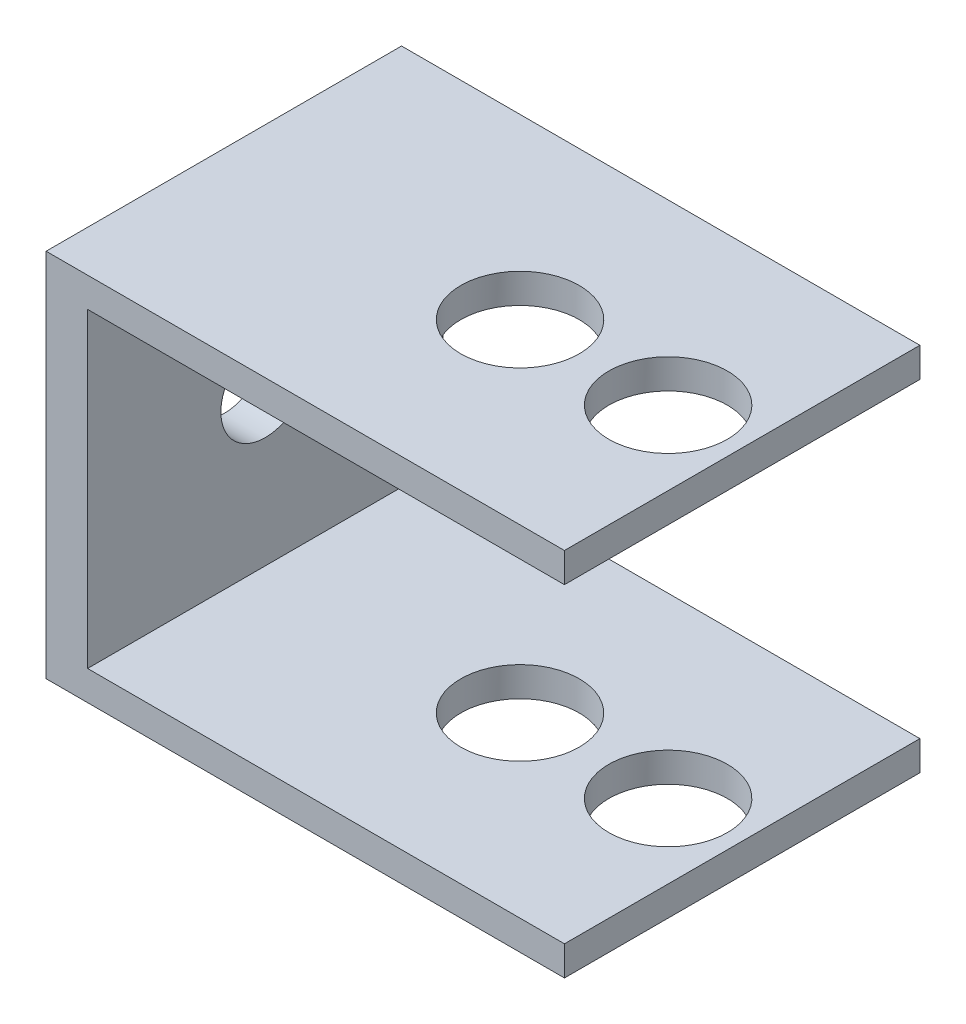
ISO-10303-21;
HEADER;
FILE_DESCRIPTION(('STEP AP214'),'2;1');
FILE_NAME('part.step','',(''),(''),'','','');
FILE_SCHEMA(('AUTOMOTIVE_DESIGN { 1 0 10303 214 1 1 1 1 }'));
ENDSEC;
DATA;
#1=APPLICATION_CONTEXT('core data for automotive mechanical design processes');
#2=APPLICATION_PROTOCOL_DEFINITION('international standard','automotive_design',2000,#1);
#3=PRODUCT_CONTEXT('',#1,'mechanical');
#4=PRODUCT('Part','Part','',(#3));
#5=PRODUCT_RELATED_PRODUCT_CATEGORY('part','',(#4));
#6=PRODUCT_DEFINITION_FORMATION('','',#4);
#7=PRODUCT_DEFINITION_CONTEXT('part definition',#1,'design');
#8=PRODUCT_DEFINITION('design','',#6,#7);
#9=PRODUCT_DEFINITION_SHAPE('','',#8);
#10=(LENGTH_UNIT() NAMED_UNIT(*) SI_UNIT(.MILLI.,.METRE.));
#11=(NAMED_UNIT(*) PLANE_ANGLE_UNIT() SI_UNIT($,.RADIAN.));
#12=(NAMED_UNIT(*) SI_UNIT($,.STERADIAN.) SOLID_ANGLE_UNIT());
#13=UNCERTAINTY_MEASURE_WITH_UNIT(LENGTH_MEASURE(1.E-05),#10,'distance_accuracy_value','');
#14=(GEOMETRIC_REPRESENTATION_CONTEXT(3) GLOBAL_UNCERTAINTY_ASSIGNED_CONTEXT((#13)) GLOBAL_UNIT_ASSIGNED_CONTEXT((#10,
#11,#12)) REPRESENTATION_CONTEXT('',''));
#15=CARTESIAN_POINT('',(0.,0.,0.));
#16=DIRECTION('',(0.,0.,1.));
#17=DIRECTION('',(1.,0.,0.));
#18=AXIS2_PLACEMENT_3D('',#15,#16,#17);
#19=CARTESIAN_POINT('',(-17.5,-12.5,24.));
#20=DIRECTION('',(0.,1.,0.));
#21=DIRECTION('',(0.,0.,1.));
#22=AXIS2_PLACEMENT_3D('',#19,#20,#21);
#23=PLANE('',#22);
#24=CARTESIAN_POINT('',(12.5,-12.5,12.));
#25=DIRECTION('',(0.,1.,0.));
#26=DIRECTION('',(0.,0.,1.));
#27=AXIS2_PLACEMENT_3D('',#24,#25,#26);
#28=CIRCLE('',#27,4.);
#29=CARTESIAN_POINT('',(12.5,-12.5,16.));
#30=VERTEX_POINT('',#29);
#31=EDGE_CURVE('E190',#30,#30,#28,.F.);
#32=ORIENTED_EDGE('',*,*,#31,.F.);
#33=EDGE_LOOP('',(#32));
#34=FACE_BOUND('',#33,.T.);
#35=CARTESIAN_POINT('',(2.5,-12.5,12.));
#36=DIRECTION('',(0.,1.,0.));
#37=DIRECTION('',(0.,0.,1.));
#38=AXIS2_PLACEMENT_3D('',#35,#36,#37);
#39=CIRCLE('',#38,4.);
#40=CARTESIAN_POINT('',(2.5,-12.5,16.));
#41=VERTEX_POINT('',#40);
#42=EDGE_CURVE('E191',#41,#41,#39,.F.);
#43=ORIENTED_EDGE('',*,*,#42,.F.);
#44=EDGE_LOOP('',(#43));
#45=FACE_BOUND('',#44,.T.);
#46=DIRECTION('',(1.,0.,0.));
#47=VECTOR('',#46,1.);
#48=CARTESIAN_POINT('',(-17.5,-12.5,0.));
#49=LINE('',#48,#47);
#50=CARTESIAN_POINT('',(-17.5,-12.5,0.));
#51=VERTEX_POINT('',#50);
#52=CARTESIAN_POINT('',(17.5,-12.5,0.));
#53=VERTEX_POINT('',#52);
#54=EDGE_CURVE('E131',#51,#53,#49,.T.);
#55=ORIENTED_EDGE('',*,*,#54,.T.);
#56=DIRECTION('',(0.,0.,-1.));
#57=VECTOR('',#56,1.);
#58=CARTESIAN_POINT('',(17.5,-12.5,24.));
#59=LINE('',#58,#57);
#60=CARTESIAN_POINT('',(17.5,-12.5,24.));
#61=VERTEX_POINT('',#60);
#62=EDGE_CURVE('E11',#61,#53,#59,.T.);
#63=ORIENTED_EDGE('',*,*,#62,.F.);
#64=DIRECTION('',(1.,0.,0.));
#65=VECTOR('',#64,1.);
#66=CARTESIAN_POINT('',(-17.5,-12.5,24.));
#67=LINE('',#66,#65);
#68=CARTESIAN_POINT('',(-17.5,-12.5,24.));
#69=VERTEX_POINT('',#68);
#70=EDGE_CURVE('E146',#69,#61,#67,.T.);
#71=ORIENTED_EDGE('',*,*,#70,.F.);
#72=DIRECTION('',(0.,0.,-1.));
#73=VECTOR('',#72,1.);
#74=CARTESIAN_POINT('',(-17.5,-12.5,24.));
#75=LINE('',#74,#73);
#76=EDGE_CURVE('E127',#69,#51,#75,.T.);
#77=ORIENTED_EDGE('',*,*,#76,.T.);
#78=EDGE_LOOP('',(#55,#63,#71,#77));
#79=FACE_BOUND('',#78,.T.);
#80=ADVANCED_FACE('F35',(#34,#45,#79),#23,.F.);
#81=CARTESIAN_POINT('',(17.5,-10.5,24.));
#82=DIRECTION('',(-1.,0.,0.));
#83=DIRECTION('',(0.,0.,1.));
#84=AXIS2_PLACEMENT_3D('',#81,#82,#83);
#85=PLANE('',#84);
#86=DIRECTION('',(0.,1.,0.));
#87=VECTOR('',#86,1.);
#88=CARTESIAN_POINT('',(17.5,-10.5,0.));
#89=LINE('',#88,#87);
#90=CARTESIAN_POINT('',(17.5,-10.5,0.));
#91=VERTEX_POINT('',#90);
#92=EDGE_CURVE('E134',#53,#91,#89,.T.);
#93=ORIENTED_EDGE('',*,*,#92,.T.);
#94=DIRECTION('',(0.,0.,-1.));
#95=VECTOR('',#94,1.);
#96=CARTESIAN_POINT('',(17.5,-10.5,24.));
#97=LINE('',#96,#95);
#98=CARTESIAN_POINT('',(17.5,-10.5,24.));
#99=VERTEX_POINT('',#98);
#100=EDGE_CURVE('E43',#99,#91,#97,.T.);
#101=ORIENTED_EDGE('',*,*,#100,.F.);
#102=DIRECTION('',(0.,1.,0.));
#103=VECTOR('',#102,1.);
#104=CARTESIAN_POINT('',(17.5,-10.5,24.));
#105=LINE('',#104,#103);
#106=EDGE_CURVE('E94',#61,#99,#105,.T.);
#107=ORIENTED_EDGE('',*,*,#106,.F.);
#108=ORIENTED_EDGE('',*,*,#62,.T.);
#109=EDGE_LOOP('',(#93,#101,#107,#108));
#110=FACE_BOUND('',#109,.T.);
#111=ADVANCED_FACE('F224',(#110),#85,.F.);
#112=CARTESIAN_POINT('',(17.5,-10.5,24.));
#113=DIRECTION('',(0.,-1.,0.));
#114=DIRECTION('',(1.,0.,0.));
#115=AXIS2_PLACEMENT_3D('',#112,#113,#114);
#116=PLANE('',#115);
#117=CARTESIAN_POINT('',(12.5,-10.5,12.));
#118=DIRECTION('',(0.,-1.,0.));
#119=DIRECTION('',(1.,0.,0.));
#120=AXIS2_PLACEMENT_3D('',#117,#118,#119);
#121=CIRCLE('',#120,4.);
#122=CARTESIAN_POINT('',(16.5,-10.5,12.));
#123=VERTEX_POINT('',#122);
#124=EDGE_CURVE('E135',#123,#123,#121,.T.);
#125=ORIENTED_EDGE('',*,*,#124,.T.);
#126=EDGE_LOOP('',(#125));
#127=FACE_BOUND('',#126,.T.);
#128=CARTESIAN_POINT('',(2.5,-10.5,12.));
#129=DIRECTION('',(0.,-1.,0.));
#130=DIRECTION('',(1.,0.,0.));
#131=AXIS2_PLACEMENT_3D('',#128,#129,#130);
#132=CIRCLE('',#131,4.);
#133=CARTESIAN_POINT('',(6.5,-10.5,12.));
#134=VERTEX_POINT('',#133);
#135=EDGE_CURVE('E184',#134,#134,#132,.T.);
#136=ORIENTED_EDGE('',*,*,#135,.T.);
#137=EDGE_LOOP('',(#136));
#138=FACE_BOUND('',#137,.T.);
#139=DIRECTION('',(-1.,0.,0.));
#140=VECTOR('',#139,1.);
#141=CARTESIAN_POINT('',(17.5,-10.5,0.));
#142=LINE('',#141,#140);
#143=CARTESIAN_POINT('',(-14.7,-10.5,0.));
#144=VERTEX_POINT('',#143);
#145=EDGE_CURVE('E137',#91,#144,#142,.T.);
#146=ORIENTED_EDGE('',*,*,#145,.T.);
#147=DIRECTION('',(0.,0.,-1.));
#148=VECTOR('',#147,1.);
#149=CARTESIAN_POINT('',(-14.7,-10.5,24.));
#150=LINE('',#149,#148);
#151=CARTESIAN_POINT('',(-14.7,-10.5,24.));
#152=VERTEX_POINT('',#151);
#153=EDGE_CURVE('E153',#152,#144,#150,.T.);
#154=ORIENTED_EDGE('',*,*,#153,.F.);
#155=DIRECTION('',(-1.,0.,0.));
#156=VECTOR('',#155,1.);
#157=CARTESIAN_POINT('',(17.5,-10.5,24.));
#158=LINE('',#157,#156);
#159=EDGE_CURVE('E161',#99,#152,#158,.T.);
#160=ORIENTED_EDGE('',*,*,#159,.F.);
#161=ORIENTED_EDGE('',*,*,#100,.T.);
#162=EDGE_LOOP('',(#146,#154,#160,#161));
#163=FACE_BOUND('',#162,.T.);
#164=ADVANCED_FACE('F159',(#127,#138,#163),#116,.F.);
#165=CARTESIAN_POINT('',(-14.7,10.5,24.));
#166=DIRECTION('',(-1.,0.,0.));
#167=DIRECTION('',(0.,-1.,0.));
#168=AXIS2_PLACEMENT_3D('',#165,#166,#167);
#169=PLANE('',#168);
#170=CARTESIAN_POINT('',(-14.7,0.,12.));
#171=DIRECTION('',(-1.,0.,0.));
#172=DIRECTION('',(0.,-1.,0.));
#173=AXIS2_PLACEMENT_3D('',#170,#171,#172);
#174=CIRCLE('',#173,3.);
#175=CARTESIAN_POINT('',(-14.7,-3.,12.));
#176=VERTEX_POINT('',#175);
#177=EDGE_CURVE('E198',#176,#176,#174,.F.);
#178=ORIENTED_EDGE('',*,*,#177,.F.);
#179=EDGE_LOOP('',(#178));
#180=FACE_BOUND('',#179,.T.);
#181=DIRECTION('',(0.,1.,0.));
#182=VECTOR('',#181,1.);
#183=CARTESIAN_POINT('',(-14.7,10.5,0.));
#184=LINE('',#183,#182);
#185=CARTESIAN_POINT('',(-14.7,10.5,0.));
#186=VERTEX_POINT('',#185);
#187=EDGE_CURVE('E139',#144,#186,#184,.T.);
#188=ORIENTED_EDGE('',*,*,#187,.T.);
#189=DIRECTION('',(0.,0.,-1.));
#190=VECTOR('',#189,1.);
#191=CARTESIAN_POINT('',(-14.7,10.5,24.));
#192=LINE('',#191,#190);
#193=CARTESIAN_POINT('',(-14.7,10.5,24.));
#194=VERTEX_POINT('',#193);
#195=EDGE_CURVE('E150',#194,#186,#192,.T.);
#196=ORIENTED_EDGE('',*,*,#195,.F.);
#197=DIRECTION('',(0.,1.,0.));
#198=VECTOR('',#197,1.);
#199=CARTESIAN_POINT('',(-14.7,10.5,24.));
#200=LINE('',#199,#198);
#201=EDGE_CURVE('E173',#152,#194,#200,.T.);
#202=ORIENTED_EDGE('',*,*,#201,.F.);
#203=ORIENTED_EDGE('',*,*,#153,.T.);
#204=EDGE_LOOP('',(#188,#196,#202,#203));
#205=FACE_BOUND('',#204,.T.);
#206=ADVANCED_FACE('F169',(#180,#205),#169,.F.);
#207=CARTESIAN_POINT('',(17.5,10.5,24.));
#208=DIRECTION('',(0.,1.,0.));
#209=DIRECTION('',(-1.,0.,0.));
#210=AXIS2_PLACEMENT_3D('',#207,#208,#209);
#211=PLANE('',#210);
#212=CARTESIAN_POINT('',(12.5,10.5,12.));
#213=DIRECTION('',(0.,1.,0.));
#214=DIRECTION('',(-1.,0.,0.));
#215=AXIS2_PLACEMENT_3D('',#212,#213,#214);
#216=CIRCLE('',#215,4.);
#217=CARTESIAN_POINT('',(8.5,10.5,12.));
#218=VERTEX_POINT('',#217);
#219=EDGE_CURVE('E181',#218,#218,#216,.T.);
#220=ORIENTED_EDGE('',*,*,#219,.T.);
#221=EDGE_LOOP('',(#220));
#222=FACE_BOUND('',#221,.T.);
#223=CARTESIAN_POINT('',(2.5,10.5,12.));
#224=DIRECTION('',(0.,1.,0.));
#225=DIRECTION('',(-1.,0.,0.));
#226=AXIS2_PLACEMENT_3D('',#223,#224,#225);
#227=CIRCLE('',#226,4.);
#228=CARTESIAN_POINT('',(-1.5,10.5,12.));
#229=VERTEX_POINT('',#228);
#230=EDGE_CURVE('E187',#229,#229,#227,.T.);
#231=ORIENTED_EDGE('',*,*,#230,.T.);
#232=EDGE_LOOP('',(#231));
#233=FACE_BOUND('',#232,.T.);
#234=DIRECTION('',(1.,0.,0.));
#235=VECTOR('',#234,1.);
#236=CARTESIAN_POINT('',(17.5,10.5,0.));
#237=LINE('',#236,#235);
#238=CARTESIAN_POINT('',(17.5,10.5,0.));
#239=VERTEX_POINT('',#238);
#240=EDGE_CURVE('E141',#186,#239,#237,.T.);
#241=ORIENTED_EDGE('',*,*,#240,.T.);
#242=DIRECTION('',(0.,0.,-1.));
#243=VECTOR('',#242,1.);
#244=CARTESIAN_POINT('',(17.5,10.5,24.));
#245=LINE('',#244,#243);
#246=CARTESIAN_POINT('',(17.5,10.5,24.));
#247=VERTEX_POINT('',#246);
#248=EDGE_CURVE('E122',#247,#239,#245,.T.);
#249=ORIENTED_EDGE('',*,*,#248,.F.);
#250=DIRECTION('',(1.,0.,0.));
#251=VECTOR('',#250,1.);
#252=CARTESIAN_POINT('',(17.5,10.5,24.));
#253=LINE('',#252,#251);
#254=EDGE_CURVE('E113',#194,#247,#253,.T.);
#255=ORIENTED_EDGE('',*,*,#254,.F.);
#256=ORIENTED_EDGE('',*,*,#195,.T.);
#257=EDGE_LOOP('',(#241,#249,#255,#256));
#258=FACE_BOUND('',#257,.T.);
#259=ADVANCED_FACE('F172',(#222,#233,#258),#211,.F.);
#260=CARTESIAN_POINT('',(17.5,12.5,24.));
#261=DIRECTION('',(-1.,0.,0.));
#262=DIRECTION('',(0.,0.,1.));
#263=AXIS2_PLACEMENT_3D('',#260,#261,#262);
#264=PLANE('',#263);
#265=DIRECTION('',(0.,1.,0.));
#266=VECTOR('',#265,1.);
#267=CARTESIAN_POINT('',(17.5,12.5,0.));
#268=LINE('',#267,#266);
#269=CARTESIAN_POINT('',(17.5,12.5,0.));
#270=VERTEX_POINT('',#269);
#271=EDGE_CURVE('E121',#239,#270,#268,.T.);
#272=ORIENTED_EDGE('',*,*,#271,.T.);
#273=DIRECTION('',(0.,0.,-1.));
#274=VECTOR('',#273,1.);
#275=CARTESIAN_POINT('',(17.5,12.5,24.));
#276=LINE('',#275,#274);
#277=CARTESIAN_POINT('',(17.5,12.5,24.));
#278=VERTEX_POINT('',#277);
#279=EDGE_CURVE('E118',#278,#270,#276,.T.);
#280=ORIENTED_EDGE('',*,*,#279,.F.);
#281=DIRECTION('',(0.,1.,0.));
#282=VECTOR('',#281,1.);
#283=CARTESIAN_POINT('',(17.5,12.5,24.));
#284=LINE('',#283,#282);
#285=EDGE_CURVE('E107',#247,#278,#284,.T.);
#286=ORIENTED_EDGE('',*,*,#285,.F.);
#287=ORIENTED_EDGE('',*,*,#248,.T.);
#288=EDGE_LOOP('',(#272,#280,#286,#287));
#289=FACE_BOUND('',#288,.T.);
#290=ADVANCED_FACE('F119',(#289),#264,.F.);
#291=CARTESIAN_POINT('',(-17.5,12.5,24.));
#292=DIRECTION('',(0.,-1.,0.));
#293=DIRECTION('',(0.,0.,-1.));
#294=AXIS2_PLACEMENT_3D('',#291,#292,#293);
#295=PLANE('',#294);
#296=CARTESIAN_POINT('',(12.5,12.5,12.));
#297=DIRECTION('',(0.,1.,0.));
#298=DIRECTION('',(0.,0.,1.));
#299=AXIS2_PLACEMENT_3D('',#296,#297,#298);
#300=CIRCLE('',#299,4.);
#301=CARTESIAN_POINT('',(12.5,12.5,16.));
#302=VERTEX_POINT('',#301);
#303=EDGE_CURVE('E194',#302,#302,#300,.T.);
#304=ORIENTED_EDGE('',*,*,#303,.F.);
#305=EDGE_LOOP('',(#304));
#306=FACE_BOUND('',#305,.T.);
#307=CARTESIAN_POINT('',(2.5,12.5,12.));
#308=DIRECTION('',(0.,1.,0.));
#309=DIRECTION('',(0.,0.,1.));
#310=AXIS2_PLACEMENT_3D('',#307,#308,#309);
#311=CIRCLE('',#310,4.);
#312=CARTESIAN_POINT('',(2.5,12.5,16.));
#313=VERTEX_POINT('',#312);
#314=EDGE_CURVE('E195',#313,#313,#311,.T.);
#315=ORIENTED_EDGE('',*,*,#314,.F.);
#316=EDGE_LOOP('',(#315));
#317=FACE_BOUND('',#316,.T.);
#318=DIRECTION('',(-1.,0.,0.));
#319=VECTOR('',#318,1.);
#320=CARTESIAN_POINT('',(-17.5,12.5,0.));
#321=LINE('',#320,#319);
#322=CARTESIAN_POINT('',(-17.5,12.5,0.));
#323=VERTEX_POINT('',#322);
#324=EDGE_CURVE('E80',#270,#323,#321,.T.);
#325=ORIENTED_EDGE('',*,*,#324,.T.);
#326=DIRECTION('',(0.,0.,-1.));
#327=VECTOR('',#326,1.);
#328=CARTESIAN_POINT('',(-17.5,12.5,24.));
#329=LINE('',#328,#327);
#330=CARTESIAN_POINT('',(-17.5,12.5,24.));
#331=VERTEX_POINT('',#330);
#332=EDGE_CURVE('E123',#331,#323,#329,.T.);
#333=ORIENTED_EDGE('',*,*,#332,.F.);
#334=DIRECTION('',(-1.,0.,0.));
#335=VECTOR('',#334,1.);
#336=CARTESIAN_POINT('',(-17.5,12.5,24.));
#337=LINE('',#336,#335);
#338=EDGE_CURVE('E111',#278,#331,#337,.T.);
#339=ORIENTED_EDGE('',*,*,#338,.F.);
#340=ORIENTED_EDGE('',*,*,#279,.T.);
#341=EDGE_LOOP('',(#325,#333,#339,#340));
#342=FACE_BOUND('',#341,.T.);
#343=ADVANCED_FACE('F125',(#306,#317,#342),#295,.F.);
#344=CARTESIAN_POINT('',(-17.5,12.5,24.));
#345=DIRECTION('',(1.,0.,0.));
#346=DIRECTION('',(0.,1.,0.));
#347=AXIS2_PLACEMENT_3D('',#344,#345,#346);
#348=PLANE('',#347);
#349=CARTESIAN_POINT('',(-17.5,0.,12.));
#350=DIRECTION('',(-1.,0.,0.));
#351=DIRECTION('',(0.,-1.,0.));
#352=AXIS2_PLACEMENT_3D('',#349,#350,#351);
#353=CIRCLE('',#352,3.);
#354=CARTESIAN_POINT('',(-17.5,-3.,12.));
#355=VERTEX_POINT('',#354);
#356=EDGE_CURVE('E205',#355,#355,#353,.T.);
#357=ORIENTED_EDGE('',*,*,#356,.F.);
#358=EDGE_LOOP('',(#357));
#359=FACE_BOUND('',#358,.T.);
#360=DIRECTION('',(0.,-1.,0.));
#361=VECTOR('',#360,1.);
#362=CARTESIAN_POINT('',(-17.5,12.5,0.));
#363=LINE('',#362,#361);
#364=EDGE_CURVE('E86',#323,#51,#363,.T.);
#365=ORIENTED_EDGE('',*,*,#364,.T.);
#366=ORIENTED_EDGE('',*,*,#76,.F.);
#367=DIRECTION('',(0.,-1.,0.));
#368=VECTOR('',#367,1.);
#369=CARTESIAN_POINT('',(-17.5,12.5,24.));
#370=LINE('',#369,#368);
#371=EDGE_CURVE('E51',#331,#69,#370,.T.);
#372=ORIENTED_EDGE('',*,*,#371,.F.);
#373=ORIENTED_EDGE('',*,*,#332,.T.);
#374=EDGE_LOOP('',(#365,#366,#372,#373));
#375=FACE_BOUND('',#374,.T.);
#376=ADVANCED_FACE('F212',(#359,#375),#348,.F.);
#377=CARTESIAN_POINT('',(0.,0.,24.));
#378=DIRECTION('',(0.,0.,-1.));
#379=DIRECTION('',(-1.,0.,0.));
#380=AXIS2_PLACEMENT_3D('',#377,#378,#379);
#381=PLANE('',#380);
#382=ORIENTED_EDGE('',*,*,#70,.T.);
#383=ORIENTED_EDGE('',*,*,#106,.T.);
#384=ORIENTED_EDGE('',*,*,#159,.T.);
#385=ORIENTED_EDGE('',*,*,#201,.T.);
#386=ORIENTED_EDGE('',*,*,#254,.T.);
#387=ORIENTED_EDGE('',*,*,#285,.T.);
#388=ORIENTED_EDGE('',*,*,#338,.T.);
#389=ORIENTED_EDGE('',*,*,#371,.T.);
#390=EDGE_LOOP('',(#382,#383,#384,#385,#386,#387,#388,#389));
#391=FACE_BOUND('',#390,.T.);
#392=ADVANCED_FACE('F109',(#391),#381,.F.);
#393=CARTESIAN_POINT('',(0.,0.,0.));
#394=DIRECTION('',(0.,0.,-1.));
#395=DIRECTION('',(-1.,0.,0.));
#396=AXIS2_PLACEMENT_3D('',#393,#394,#395);
#397=PLANE('',#396);
#398=ORIENTED_EDGE('',*,*,#54,.F.);
#399=ORIENTED_EDGE('',*,*,#364,.F.);
#400=ORIENTED_EDGE('',*,*,#324,.F.);
#401=ORIENTED_EDGE('',*,*,#271,.F.);
#402=ORIENTED_EDGE('',*,*,#240,.F.);
#403=ORIENTED_EDGE('',*,*,#187,.F.);
#404=ORIENTED_EDGE('',*,*,#145,.F.);
#405=ORIENTED_EDGE('',*,*,#92,.F.);
#406=EDGE_LOOP('',(#398,#399,#400,#401,#402,#403,#404,#405));
#407=FACE_BOUND('',#406,.T.);
#408=ADVANCED_FACE('F165',(#407),#397,.T.);
#409=CARTESIAN_POINT('',(2.5,-23.8137084989848,12.));
#410=DIRECTION('',(0.,1.,0.));
#411=DIRECTION('',(0.,0.,1.));
#412=AXIS2_PLACEMENT_3D('',#409,#410,#411);
#413=CYLINDRICAL_SURFACE('',#412,4.);
#414=ORIENTED_EDGE('',*,*,#314,.T.);
#415=EDGE_LOOP('',(#414));
#416=FACE_BOUND('',#415,.T.);
#417=ORIENTED_EDGE('',*,*,#230,.F.);
#418=EDGE_LOOP('',(#417));
#419=FACE_BOUND('',#418,.T.);
#420=ADVANCED_FACE('F242',(#416,#419),#413,.F.);
#421=CARTESIAN_POINT('',(12.5,-23.8137084989848,12.));
#422=DIRECTION('',(0.,1.,0.));
#423=DIRECTION('',(0.,0.,1.));
#424=AXIS2_PLACEMENT_3D('',#421,#422,#423);
#425=CYLINDRICAL_SURFACE('',#424,4.);
#426=ORIENTED_EDGE('',*,*,#303,.T.);
#427=EDGE_LOOP('',(#426));
#428=FACE_BOUND('',#427,.T.);
#429=ORIENTED_EDGE('',*,*,#219,.F.);
#430=EDGE_LOOP('',(#429));
#431=FACE_BOUND('',#430,.T.);
#432=ADVANCED_FACE('F240',(#428,#431),#425,.F.);
#433=ORIENTED_EDGE('',*,*,#42,.T.);
#434=EDGE_LOOP('',(#433));
#435=FACE_BOUND('',#434,.T.);
#436=ORIENTED_EDGE('',*,*,#135,.F.);
#437=EDGE_LOOP('',(#436));
#438=FACE_BOUND('',#437,.T.);
#439=ADVANCED_FACE('F236',(#435,#438),#413,.F.);
#440=ORIENTED_EDGE('',*,*,#31,.T.);
#441=EDGE_LOOP('',(#440));
#442=FACE_BOUND('',#441,.T.);
#443=ORIENTED_EDGE('',*,*,#124,.F.);
#444=EDGE_LOOP('',(#443));
#445=FACE_BOUND('',#444,.T.);
#446=ADVANCED_FACE('F239',(#442,#445),#425,.F.);
#447=CARTESIAN_POINT('',(17.501,0.,12.));
#448=DIRECTION('',(-1.,0.,0.));
#449=DIRECTION('',(0.,-1.,0.));
#450=AXIS2_PLACEMENT_3D('',#447,#448,#449);
#451=CYLINDRICAL_SURFACE('',#450,3.);
#452=ORIENTED_EDGE('',*,*,#356,.T.);
#453=EDGE_LOOP('',(#452));
#454=FACE_BOUND('',#453,.T.);
#455=ORIENTED_EDGE('',*,*,#177,.T.);
#456=EDGE_LOOP('',(#455));
#457=FACE_BOUND('',#456,.T.);
#458=ADVANCED_FACE('F209',(#454,#457),#451,.F.);
#459=CLOSED_SHELL('',(#80,#111,#164,#206,#259,#290,#343,#376,#392,#408,#420,#432,#439,#446,#458));
#460=MANIFOLD_SOLID_BREP('B2',#459);
#461=ADVANCED_BREP_SHAPE_REPRESENTATION('',(#18,#460),#14);
#462=SHAPE_DEFINITION_REPRESENTATION(#9,#461);
ENDSEC;
END-ISO-10303-21;
